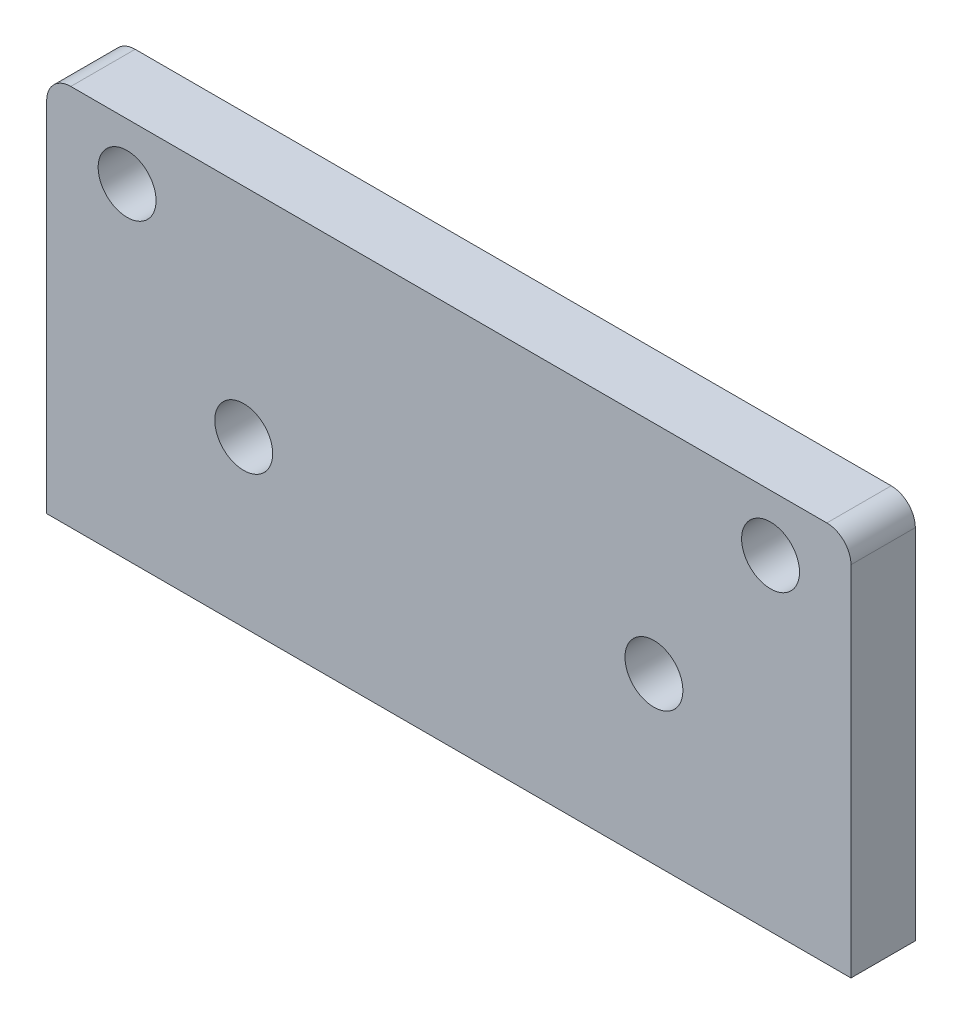
ISO-10303-21;
HEADER;
FILE_DESCRIPTION(('STEP AP214'),'2;1');
FILE_NAME('part.step','',(''),(''),'','','');
FILE_SCHEMA(('AUTOMOTIVE_DESIGN { 1 0 10303 214 1 1 1 1 }'));
ENDSEC;
DATA;
#1=APPLICATION_CONTEXT('core data for automotive mechanical design processes');
#2=APPLICATION_PROTOCOL_DEFINITION('international standard','automotive_design',2000,#1);
#3=PRODUCT_CONTEXT('',#1,'mechanical');
#4=PRODUCT('Part','Part','',(#3));
#5=PRODUCT_RELATED_PRODUCT_CATEGORY('part','',(#4));
#6=PRODUCT_DEFINITION_FORMATION('','',#4);
#7=PRODUCT_DEFINITION_CONTEXT('part definition',#1,'design');
#8=PRODUCT_DEFINITION('design','',#6,#7);
#9=PRODUCT_DEFINITION_SHAPE('','',#8);
#10=(LENGTH_UNIT() NAMED_UNIT(*) SI_UNIT(.MILLI.,.METRE.));
#11=(NAMED_UNIT(*) PLANE_ANGLE_UNIT() SI_UNIT($,.RADIAN.));
#12=(NAMED_UNIT(*) SI_UNIT($,.STERADIAN.) SOLID_ANGLE_UNIT());
#13=UNCERTAINTY_MEASURE_WITH_UNIT(LENGTH_MEASURE(1.E-05),#10,'distance_accuracy_value','');
#14=(GEOMETRIC_REPRESENTATION_CONTEXT(3) GLOBAL_UNCERTAINTY_ASSIGNED_CONTEXT((#13)) GLOBAL_UNIT_ASSIGNED_CONTEXT((#10,
#11,#12)) REPRESENTATION_CONTEXT('',''));
#15=CARTESIAN_POINT('',(0.,0.,0.));
#16=DIRECTION('',(0.,0.,1.));
#17=DIRECTION('',(1.,0.,0.));
#18=AXIS2_PLACEMENT_3D('',#15,#16,#17);
#19=CARTESIAN_POINT('',(25.,11.875,4.));
#20=DIRECTION('',(-1.,0.,0.));
#21=DIRECTION('',(0.,-1.,0.));
#22=AXIS2_PLACEMENT_3D('',#19,#20,#21);
#23=PLANE('',#22);
#24=DIRECTION('',(0.,1.,0.));
#25=VECTOR('',#24,1.);
#26=CARTESIAN_POINT('',(25.,11.875,0.));
#27=LINE('',#26,#25);
#28=CARTESIAN_POINT('',(25.,-11.875,0.));
#29=VERTEX_POINT('',#28);
#30=CARTESIAN_POINT('',(25.,10.375,0.));
#31=VERTEX_POINT('',#30);
#32=EDGE_CURVE('E140',#29,#31,#27,.T.);
#33=ORIENTED_EDGE('',*,*,#32,.T.);
#34=DIRECTION('',(0.,0.,-1.));
#35=VECTOR('',#34,1.);
#36=CARTESIAN_POINT('',(25.,10.375,4.));
#37=LINE('',#36,#35);
#38=CARTESIAN_POINT('',(25.,10.375,4.));
#39=VERTEX_POINT('',#38);
#40=EDGE_CURVE('E11',#31,#39,#37,.F.);
#41=ORIENTED_EDGE('',*,*,#40,.T.);
#42=DIRECTION('',(0.,1.,0.));
#43=VECTOR('',#42,1.);
#44=CARTESIAN_POINT('',(25.,11.875,4.));
#45=LINE('',#44,#43);
#46=CARTESIAN_POINT('',(25.,-11.875,4.));
#47=VERTEX_POINT('',#46);
#48=EDGE_CURVE('E151',#47,#39,#45,.T.);
#49=ORIENTED_EDGE('',*,*,#48,.F.);
#50=DIRECTION('',(0.,0.,-1.));
#51=VECTOR('',#50,1.);
#52=CARTESIAN_POINT('',(25.,-11.875,4.));
#53=LINE('',#52,#51);
#54=EDGE_CURVE('E128',#47,#29,#53,.T.);
#55=ORIENTED_EDGE('',*,*,#54,.T.);
#56=EDGE_LOOP('',(#33,#41,#49,#55));
#57=FACE_BOUND('',#56,.T.);
#58=ADVANCED_FACE('F39',(#57),#23,.F.);
#59=CARTESIAN_POINT('',(-25.,11.875,4.));
#60=DIRECTION('',(0.,-1.,0.));
#61=DIRECTION('',(0.,0.,-1.));
#62=AXIS2_PLACEMENT_3D('',#59,#60,#61);
#63=PLANE('',#62);
#64=DIRECTION('',(-1.,0.,0.));
#65=VECTOR('',#64,1.);
#66=CARTESIAN_POINT('',(-25.,11.875,0.));
#67=LINE('',#66,#65);
#68=CARTESIAN_POINT('',(23.5,11.875,0.));
#69=VERTEX_POINT('',#68);
#70=CARTESIAN_POINT('',(-23.5,11.875,0.));
#71=VERTEX_POINT('',#70);
#72=EDGE_CURVE('E143',#69,#71,#67,.T.);
#73=ORIENTED_EDGE('',*,*,#72,.T.);
#74=DIRECTION('',(0.,0.,-1.));
#75=VECTOR('',#74,1.);
#76=CARTESIAN_POINT('',(-23.5,11.875,4.));
#77=LINE('',#76,#75);
#78=CARTESIAN_POINT('',(-23.5,11.875,4.));
#79=VERTEX_POINT('',#78);
#80=EDGE_CURVE('E66',#71,#79,#77,.F.);
#81=ORIENTED_EDGE('',*,*,#80,.T.);
#82=DIRECTION('',(-1.,0.,0.));
#83=VECTOR('',#82,1.);
#84=CARTESIAN_POINT('',(-25.,11.875,4.));
#85=LINE('',#84,#83);
#86=CARTESIAN_POINT('',(23.5,11.875,4.));
#87=VERTEX_POINT('',#86);
#88=EDGE_CURVE('E117',#87,#79,#85,.T.);
#89=ORIENTED_EDGE('',*,*,#88,.F.);
#90=DIRECTION('',(0.,0.,-1.));
#91=VECTOR('',#90,1.);
#92=CARTESIAN_POINT('',(23.5,11.875,4.));
#93=LINE('',#92,#91);
#94=EDGE_CURVE('E161',#87,#69,#93,.T.);
#95=ORIENTED_EDGE('',*,*,#94,.T.);
#96=EDGE_LOOP('',(#73,#81,#89,#95));
#97=FACE_BOUND('',#96,.T.);
#98=ADVANCED_FACE('F213',(#97),#63,.F.);
#99=CARTESIAN_POINT('',(-25.,11.875,4.));
#100=DIRECTION('',(1.,0.,0.));
#101=DIRECTION('',(0.,1.,0.));
#102=AXIS2_PLACEMENT_3D('',#99,#100,#101);
#103=PLANE('',#102);
#104=DIRECTION('',(0.,-1.,0.));
#105=VECTOR('',#104,1.);
#106=CARTESIAN_POINT('',(-25.,11.875,4.));
#107=LINE('',#106,#105);
#108=CARTESIAN_POINT('',(-25.,10.375,4.));
#109=VERTEX_POINT('',#108);
#110=CARTESIAN_POINT('',(-25.,-11.875,4.));
#111=VERTEX_POINT('',#110);
#112=EDGE_CURVE('E106',#109,#111,#107,.T.);
#113=ORIENTED_EDGE('',*,*,#112,.F.);
#114=DIRECTION('',(0.,0.,-1.));
#115=VECTOR('',#114,1.);
#116=CARTESIAN_POINT('',(-25.,10.375,4.));
#117=LINE('',#116,#115);
#118=CARTESIAN_POINT('',(-25.,10.375,0.));
#119=VERTEX_POINT('',#118);
#120=EDGE_CURVE('E127',#109,#119,#117,.T.);
#121=ORIENTED_EDGE('',*,*,#120,.T.);
#122=DIRECTION('',(0.,-1.,0.));
#123=VECTOR('',#122,1.);
#124=CARTESIAN_POINT('',(-25.,11.875,0.));
#125=LINE('',#124,#123);
#126=CARTESIAN_POINT('',(-25.,-11.875,0.));
#127=VERTEX_POINT('',#126);
#128=EDGE_CURVE('E123',#119,#127,#125,.T.);
#129=ORIENTED_EDGE('',*,*,#128,.T.);
#130=DIRECTION('',(0.,0.,-1.));
#131=VECTOR('',#130,1.);
#132=CARTESIAN_POINT('',(-25.,-11.875,4.));
#133=LINE('',#132,#131);
#134=EDGE_CURVE('E120',#111,#127,#133,.T.);
#135=ORIENTED_EDGE('',*,*,#134,.F.);
#136=EDGE_LOOP('',(#113,#121,#129,#135));
#137=FACE_BOUND('',#136,.T.);
#138=ADVANCED_FACE('F121',(#137),#103,.F.);
#139=CARTESIAN_POINT('',(-25.,-11.875,4.));
#140=DIRECTION('',(0.,1.,0.));
#141=DIRECTION('',(0.,0.,1.));
#142=AXIS2_PLACEMENT_3D('',#139,#140,#141);
#143=PLANE('',#142);
#144=DIRECTION('',(1.,0.,0.));
#145=VECTOR('',#144,1.);
#146=CARTESIAN_POINT('',(-25.,-11.875,0.));
#147=LINE('',#146,#145);
#148=EDGE_CURVE('E149',#127,#29,#147,.T.);
#149=ORIENTED_EDGE('',*,*,#148,.T.);
#150=ORIENTED_EDGE('',*,*,#54,.F.);
#151=DIRECTION('',(1.,0.,0.));
#152=VECTOR('',#151,1.);
#153=CARTESIAN_POINT('',(-25.,-11.875,4.));
#154=LINE('',#153,#152);
#155=EDGE_CURVE('E110',#111,#47,#154,.T.);
#156=ORIENTED_EDGE('',*,*,#155,.F.);
#157=ORIENTED_EDGE('',*,*,#134,.T.);
#158=EDGE_LOOP('',(#149,#150,#156,#157));
#159=FACE_BOUND('',#158,.T.);
#160=ADVANCED_FACE('F130',(#159),#143,.F.);
#161=CARTESIAN_POINT('',(0.,0.,4.));
#162=DIRECTION('',(0.,0.,1.));
#163=DIRECTION('',(1.,0.,0.));
#164=AXIS2_PLACEMENT_3D('',#161,#162,#163);
#165=PLANE('',#164);
#166=CARTESIAN_POINT('',(20.,8.375,4.));
#167=DIRECTION('',(0.,0.,1.));
#168=DIRECTION('',(1.,0.,0.));
#169=AXIS2_PLACEMENT_3D('',#166,#167,#168);
#170=CIRCLE('',#169,1.8);
#171=CARTESIAN_POINT('',(21.8,8.375,4.));
#172=VERTEX_POINT('',#171);
#173=EDGE_CURVE('E179',#172,#172,#170,.T.);
#174=ORIENTED_EDGE('',*,*,#173,.F.);
#175=EDGE_LOOP('',(#174));
#176=FACE_BOUND('',#175,.T.);
#177=CARTESIAN_POINT('',(12.75,-1.62499999999999,4.));
#178=DIRECTION('',(0.,0.,1.));
#179=DIRECTION('',(1.,0.,0.));
#180=AXIS2_PLACEMENT_3D('',#177,#178,#179);
#181=CIRCLE('',#180,1.8);
#182=CARTESIAN_POINT('',(14.55,-1.62499999999999,4.));
#183=VERTEX_POINT('',#182);
#184=EDGE_CURVE('E188',#183,#183,#181,.T.);
#185=ORIENTED_EDGE('',*,*,#184,.F.);
#186=EDGE_LOOP('',(#185));
#187=FACE_BOUND('',#186,.T.);
#188=CARTESIAN_POINT('',(-20.,8.375,4.));
#189=DIRECTION('',(0.,0.,1.));
#190=DIRECTION('',(1.,0.,0.));
#191=AXIS2_PLACEMENT_3D('',#188,#189,#190);
#192=CIRCLE('',#191,1.8);
#193=CARTESIAN_POINT('',(-18.2,8.375,4.));
#194=VERTEX_POINT('',#193);
#195=EDGE_CURVE('E187',#194,#194,#192,.T.);
#196=ORIENTED_EDGE('',*,*,#195,.F.);
#197=EDGE_LOOP('',(#196));
#198=FACE_BOUND('',#197,.T.);
#199=CARTESIAN_POINT('',(-12.75,-1.625,4.));
#200=DIRECTION('',(0.,0.,1.));
#201=DIRECTION('',(1.,0.,0.));
#202=AXIS2_PLACEMENT_3D('',#199,#200,#201);
#203=CIRCLE('',#202,1.8);
#204=CARTESIAN_POINT('',(-10.95,-1.625,4.));
#205=VERTEX_POINT('',#204);
#206=EDGE_CURVE('E172',#205,#205,#203,.T.);
#207=ORIENTED_EDGE('',*,*,#206,.F.);
#208=EDGE_LOOP('',(#207));
#209=FACE_BOUND('',#208,.T.);
#210=ORIENTED_EDGE('',*,*,#88,.T.);
#211=CARTESIAN_POINT('',(-23.5,10.375,4.));
#212=DIRECTION('',(0.,0.,1.));
#213=DIRECTION('',(1.,0.,0.));
#214=AXIS2_PLACEMENT_3D('',#211,#212,#213);
#215=CIRCLE('',#214,1.5);
#216=EDGE_CURVE('E48',#79,#109,#215,.T.);
#217=ORIENTED_EDGE('',*,*,#216,.T.);
#218=ORIENTED_EDGE('',*,*,#112,.T.);
#219=ORIENTED_EDGE('',*,*,#155,.T.);
#220=ORIENTED_EDGE('',*,*,#48,.T.);
#221=CARTESIAN_POINT('',(23.5,10.375,4.));
#222=DIRECTION('',(0.,0.,1.));
#223=DIRECTION('',(1.,0.,0.));
#224=AXIS2_PLACEMENT_3D('',#221,#222,#223);
#225=CIRCLE('',#224,1.5);
#226=EDGE_CURVE('E167',#39,#87,#225,.T.);
#227=ORIENTED_EDGE('',*,*,#226,.T.);
#228=EDGE_LOOP('',(#210,#217,#218,#219,#220,#227));
#229=FACE_BOUND('',#228,.T.);
#230=ADVANCED_FACE('F108',(#176,#187,#198,#209,#229),#165,.T.);
#231=CARTESIAN_POINT('',(0.,0.,0.));
#232=DIRECTION('',(0.,0.,1.));
#233=DIRECTION('',(1.,0.,0.));
#234=AXIS2_PLACEMENT_3D('',#231,#232,#233);
#235=PLANE('',#234);
#236=CARTESIAN_POINT('',(20.,8.375,0.));
#237=DIRECTION('',(0.,0.,1.));
#238=DIRECTION('',(1.,0.,0.));
#239=AXIS2_PLACEMENT_3D('',#236,#237,#238);
#240=CIRCLE('',#239,1.8);
#241=CARTESIAN_POINT('',(21.8,8.375,0.));
#242=VERTEX_POINT('',#241);
#243=EDGE_CURVE('E181',#242,#242,#240,.T.);
#244=ORIENTED_EDGE('',*,*,#243,.T.);
#245=EDGE_LOOP('',(#244));
#246=FACE_BOUND('',#245,.T.);
#247=CARTESIAN_POINT('',(12.75,-1.62499999999999,0.));
#248=DIRECTION('',(0.,0.,1.));
#249=DIRECTION('',(1.,0.,0.));
#250=AXIS2_PLACEMENT_3D('',#247,#248,#249);
#251=CIRCLE('',#250,1.8);
#252=CARTESIAN_POINT('',(14.55,-1.62499999999999,0.));
#253=VERTEX_POINT('',#252);
#254=EDGE_CURVE('E184',#253,#253,#251,.T.);
#255=ORIENTED_EDGE('',*,*,#254,.T.);
#256=EDGE_LOOP('',(#255));
#257=FACE_BOUND('',#256,.T.);
#258=CARTESIAN_POINT('',(-20.,8.375,0.));
#259=DIRECTION('',(0.,0.,1.));
#260=DIRECTION('',(1.,0.,0.));
#261=AXIS2_PLACEMENT_3D('',#258,#259,#260);
#262=CIRCLE('',#261,1.8);
#263=CARTESIAN_POINT('',(-18.2,8.375,0.));
#264=VERTEX_POINT('',#263);
#265=EDGE_CURVE('E174',#264,#264,#262,.T.);
#266=ORIENTED_EDGE('',*,*,#265,.T.);
#267=EDGE_LOOP('',(#266));
#268=FACE_BOUND('',#267,.T.);
#269=CARTESIAN_POINT('',(-12.75,-1.625,0.));
#270=DIRECTION('',(0.,0.,1.));
#271=DIRECTION('',(1.,0.,0.));
#272=AXIS2_PLACEMENT_3D('',#269,#270,#271);
#273=CIRCLE('',#272,1.8);
#274=CARTESIAN_POINT('',(-10.95,-1.625,0.));
#275=VERTEX_POINT('',#274);
#276=EDGE_CURVE('E144',#275,#275,#273,.T.);
#277=ORIENTED_EDGE('',*,*,#276,.T.);
#278=EDGE_LOOP('',(#277));
#279=FACE_BOUND('',#278,.T.);
#280=ORIENTED_EDGE('',*,*,#128,.F.);
#281=CARTESIAN_POINT('',(-23.5,10.375,0.));
#282=DIRECTION('',(0.,0.,1.));
#283=DIRECTION('',(1.,0.,0.));
#284=AXIS2_PLACEMENT_3D('',#281,#282,#283);
#285=CIRCLE('',#284,1.5);
#286=EDGE_CURVE('E158',#119,#71,#285,.F.);
#287=ORIENTED_EDGE('',*,*,#286,.T.);
#288=ORIENTED_EDGE('',*,*,#72,.F.);
#289=CARTESIAN_POINT('',(23.5,10.375,0.));
#290=DIRECTION('',(0.,0.,1.));
#291=DIRECTION('',(1.,0.,0.));
#292=AXIS2_PLACEMENT_3D('',#289,#290,#291);
#293=CIRCLE('',#292,1.5);
#294=EDGE_CURVE('E155',#69,#31,#293,.F.);
#295=ORIENTED_EDGE('',*,*,#294,.T.);
#296=ORIENTED_EDGE('',*,*,#32,.F.);
#297=ORIENTED_EDGE('',*,*,#148,.F.);
#298=EDGE_LOOP('',(#280,#287,#288,#295,#296,#297));
#299=FACE_BOUND('',#298,.T.);
#300=ADVANCED_FACE('F209',(#246,#257,#268,#279,#299),#235,.F.);
#301=CARTESIAN_POINT('',(-23.5,10.375,4.));
#302=DIRECTION('',(0.,0.,-1.));
#303=DIRECTION('',(-1.,0.,0.));
#304=AXIS2_PLACEMENT_3D('',#301,#302,#303);
#305=CYLINDRICAL_SURFACE('',#304,1.5);
#306=ORIENTED_EDGE('',*,*,#216,.F.);
#307=ORIENTED_EDGE('',*,*,#80,.F.);
#308=ORIENTED_EDGE('',*,*,#286,.F.);
#309=ORIENTED_EDGE('',*,*,#120,.F.);
#310=EDGE_LOOP('',(#306,#307,#308,#309));
#311=FACE_BOUND('',#310,.T.);
#312=ADVANCED_FACE('F207',(#311),#305,.T.);
#313=CARTESIAN_POINT('',(23.5,10.375,4.));
#314=DIRECTION('',(0.,0.,-1.));
#315=DIRECTION('',(-1.,0.,0.));
#316=AXIS2_PLACEMENT_3D('',#313,#314,#315);
#317=CYLINDRICAL_SURFACE('',#316,1.5);
#318=ORIENTED_EDGE('',*,*,#226,.F.);
#319=ORIENTED_EDGE('',*,*,#40,.F.);
#320=ORIENTED_EDGE('',*,*,#294,.F.);
#321=ORIENTED_EDGE('',*,*,#94,.F.);
#322=EDGE_LOOP('',(#318,#319,#320,#321));
#323=FACE_BOUND('',#322,.T.);
#324=ADVANCED_FACE('F41',(#323),#317,.T.);
#325=CARTESIAN_POINT('',(-12.75,-1.625,0.));
#326=DIRECTION('',(0.,0.,1.));
#327=DIRECTION('',(1.,0.,0.));
#328=AXIS2_PLACEMENT_3D('',#325,#326,#327);
#329=CYLINDRICAL_SURFACE('',#328,1.8);
#330=ORIENTED_EDGE('',*,*,#276,.F.);
#331=EDGE_LOOP('',(#330));
#332=FACE_BOUND('',#331,.T.);
#333=ORIENTED_EDGE('',*,*,#206,.T.);
#334=EDGE_LOOP('',(#333));
#335=FACE_BOUND('',#334,.T.);
#336=ADVANCED_FACE('F229',(#332,#335),#329,.F.);
#337=CARTESIAN_POINT('',(-20.,8.375,0.));
#338=DIRECTION('',(0.,0.,1.));
#339=DIRECTION('',(1.,0.,0.));
#340=AXIS2_PLACEMENT_3D('',#337,#338,#339);
#341=CYLINDRICAL_SURFACE('',#340,1.8);
#342=ORIENTED_EDGE('',*,*,#265,.F.);
#343=EDGE_LOOP('',(#342));
#344=FACE_BOUND('',#343,.T.);
#345=ORIENTED_EDGE('',*,*,#195,.T.);
#346=EDGE_LOOP('',(#345));
#347=FACE_BOUND('',#346,.T.);
#348=ADVANCED_FACE('F261',(#344,#347),#341,.F.);
#349=CARTESIAN_POINT('',(12.75,-1.62499999999999,0.));
#350=DIRECTION('',(0.,0.,1.));
#351=DIRECTION('',(1.,0.,0.));
#352=AXIS2_PLACEMENT_3D('',#349,#350,#351);
#353=CYLINDRICAL_SURFACE('',#352,1.8);
#354=ORIENTED_EDGE('',*,*,#254,.F.);
#355=EDGE_LOOP('',(#354));
#356=FACE_BOUND('',#355,.T.);
#357=ORIENTED_EDGE('',*,*,#184,.T.);
#358=EDGE_LOOP('',(#357));
#359=FACE_BOUND('',#358,.T.);
#360=ADVANCED_FACE('F270',(#356,#359),#353,.F.);
#361=CARTESIAN_POINT('',(20.,8.375,0.));
#362=DIRECTION('',(0.,0.,1.));
#363=DIRECTION('',(1.,0.,0.));
#364=AXIS2_PLACEMENT_3D('',#361,#362,#363);
#365=CYLINDRICAL_SURFACE('',#364,1.8);
#366=ORIENTED_EDGE('',*,*,#243,.F.);
#367=EDGE_LOOP('',(#366));
#368=FACE_BOUND('',#367,.T.);
#369=ORIENTED_EDGE('',*,*,#173,.T.);
#370=EDGE_LOOP('',(#369));
#371=FACE_BOUND('',#370,.T.);
#372=ADVANCED_FACE('F280',(#368,#371),#365,.F.);
#373=CLOSED_SHELL('',(#58,#98,#138,#160,#230,#300,#312,#324,#336,#348,#360,#372));
#374=MANIFOLD_SOLID_BREP('B2',#373);
#375=ADVANCED_BREP_SHAPE_REPRESENTATION('',(#18,#374),#14);
#376=SHAPE_DEFINITION_REPRESENTATION(#9,#375);
ENDSEC;
END-ISO-10303-21;
